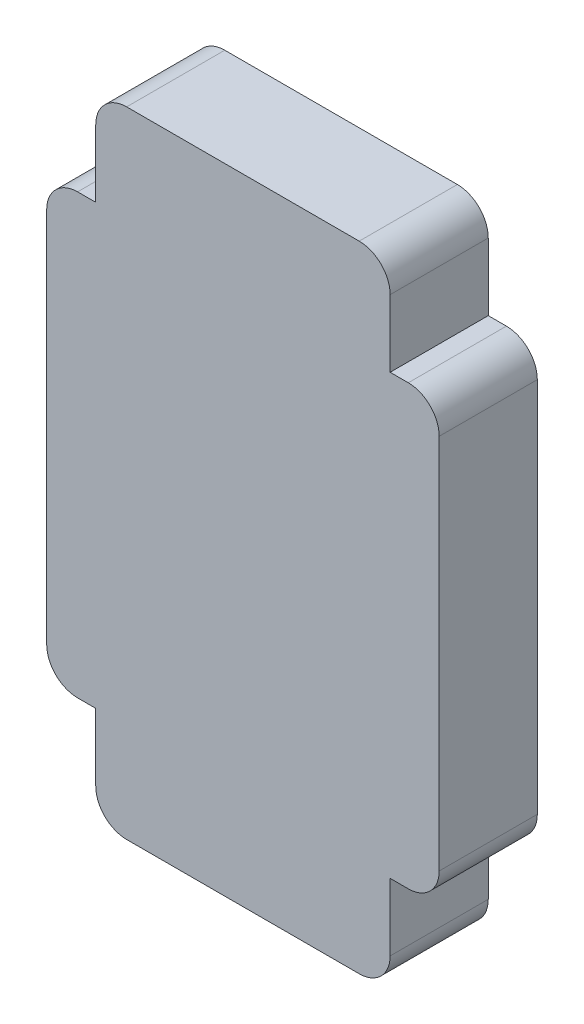
ISO-10303-21;
HEADER;
FILE_DESCRIPTION(('STEP AP214'),'2;1');
FILE_NAME('part.step','',(''),(''),'','','');
FILE_SCHEMA(('AUTOMOTIVE_DESIGN { 1 0 10303 214 1 1 1 1 }'));
ENDSEC;
DATA;
#1=APPLICATION_CONTEXT('core data for automotive mechanical design processes');
#2=APPLICATION_PROTOCOL_DEFINITION('international standard','automotive_design',2000,#1);
#3=PRODUCT_CONTEXT('',#1,'mechanical');
#4=PRODUCT('Part','Part','',(#3));
#5=PRODUCT_RELATED_PRODUCT_CATEGORY('part','',(#4));
#6=PRODUCT_DEFINITION_FORMATION('','',#4);
#7=PRODUCT_DEFINITION_CONTEXT('part definition',#1,'design');
#8=PRODUCT_DEFINITION('design','',#6,#7);
#9=PRODUCT_DEFINITION_SHAPE('','',#8);
#10=(LENGTH_UNIT() NAMED_UNIT(*) SI_UNIT(.MILLI.,.METRE.));
#11=(NAMED_UNIT(*) PLANE_ANGLE_UNIT() SI_UNIT($,.RADIAN.));
#12=(NAMED_UNIT(*) SI_UNIT($,.STERADIAN.) SOLID_ANGLE_UNIT());
#13=UNCERTAINTY_MEASURE_WITH_UNIT(LENGTH_MEASURE(1.E-05),#10,'distance_accuracy_value','');
#14=(GEOMETRIC_REPRESENTATION_CONTEXT(3) GLOBAL_UNCERTAINTY_ASSIGNED_CONTEXT((#13)) GLOBAL_UNIT_ASSIGNED_CONTEXT((#10,
#11,#12)) REPRESENTATION_CONTEXT('',''));
#15=CARTESIAN_POINT('',(0.,0.,0.));
#16=DIRECTION('',(0.,0.,1.));
#17=DIRECTION('',(1.,0.,0.));
#18=AXIS2_PLACEMENT_3D('',#15,#16,#17);
#19=CARTESIAN_POINT('',(-4.7625,0.,3.175));
#20=DIRECTION('',(1.,0.,0.));
#21=DIRECTION('',(0.,0.,-1.));
#22=AXIS2_PLACEMENT_3D('',#19,#20,#21);
#23=PLANE('',#22);
#24=DIRECTION('',(0.,-1.,0.));
#25=VECTOR('',#24,1.);
#26=CARTESIAN_POINT('',(-4.7625,0.,0.));
#27=LINE('',#26,#25);
#28=CARTESIAN_POINT('',(-4.7625,-7.09,0.));
#29=VERTEX_POINT('',#28);
#30=CARTESIAN_POINT('',(-4.7625,-9.265,0.));
#31=VERTEX_POINT('',#30);
#32=EDGE_CURVE('E280',#29,#31,#27,.T.);
#33=ORIENTED_EDGE('',*,*,#32,.T.);
#34=DIRECTION('',(0.,0.,-1.));
#35=VECTOR('',#34,1.);
#36=CARTESIAN_POINT('',(-4.7625,-9.265,3.175));
#37=LINE('',#36,#35);
#38=CARTESIAN_POINT('',(-4.7625,-9.265,3.175));
#39=VERTEX_POINT('',#38);
#40=EDGE_CURVE('E400',#31,#39,#37,.F.);
#41=ORIENTED_EDGE('',*,*,#40,.T.);
#42=DIRECTION('',(0.,-1.,0.));
#43=VECTOR('',#42,1.);
#44=CARTESIAN_POINT('',(-4.7625,0.,3.175));
#45=LINE('',#44,#43);
#46=CARTESIAN_POINT('',(-4.7625,-7.09,3.175));
#47=VERTEX_POINT('',#46);
#48=EDGE_CURVE('E253',#47,#39,#45,.T.);
#49=ORIENTED_EDGE('',*,*,#48,.F.);
#50=DIRECTION('',(0.,0.,-1.));
#51=VECTOR('',#50,1.);
#52=CARTESIAN_POINT('',(-4.7625,-7.09,3.175));
#53=LINE('',#52,#51);
#54=EDGE_CURVE('E319',#47,#29,#53,.T.);
#55=ORIENTED_EDGE('',*,*,#54,.T.);
#56=EDGE_LOOP('',(#33,#41,#49,#55));
#57=FACE_BOUND('',#56,.T.);
#58=ADVANCED_FACE('F41',(#57),#23,.F.);
#59=CARTESIAN_POINT('',(0.,-10.265,3.175));
#60=DIRECTION('',(0.,1.,0.));
#61=DIRECTION('',(0.,0.,1.));
#62=AXIS2_PLACEMENT_3D('',#59,#60,#61);
#63=PLANE('',#62);
#64=DIRECTION('',(1.,0.,0.));
#65=VECTOR('',#64,1.);
#66=CARTESIAN_POINT('',(0.,-10.265,0.));
#67=LINE('',#66,#65);
#68=CARTESIAN_POINT('',(-3.7625,-10.265,0.));
#69=VERTEX_POINT('',#68);
#70=CARTESIAN_POINT('',(3.7625,-10.265,0.));
#71=VERTEX_POINT('',#70);
#72=EDGE_CURVE('E284',#69,#71,#67,.T.);
#73=ORIENTED_EDGE('',*,*,#72,.T.);
#74=DIRECTION('',(0.,0.,-1.));
#75=VECTOR('',#74,1.);
#76=CARTESIAN_POINT('',(3.7625,-10.265,3.175));
#77=LINE('',#76,#75);
#78=CARTESIAN_POINT('',(3.7625,-10.265,3.175));
#79=VERTEX_POINT('',#78);
#80=EDGE_CURVE('E386',#71,#79,#77,.F.);
#81=ORIENTED_EDGE('',*,*,#80,.T.);
#82=DIRECTION('',(1.,0.,0.));
#83=VECTOR('',#82,1.);
#84=CARTESIAN_POINT('',(0.,-10.265,3.175));
#85=LINE('',#84,#83);
#86=CARTESIAN_POINT('',(-3.7625,-10.265,3.175));
#87=VERTEX_POINT('',#86);
#88=EDGE_CURVE('E248',#87,#79,#85,.T.);
#89=ORIENTED_EDGE('',*,*,#88,.F.);
#90=DIRECTION('',(0.,0.,-1.));
#91=VECTOR('',#90,1.);
#92=CARTESIAN_POINT('',(-3.7625,-10.265,3.175));
#93=LINE('',#92,#91);
#94=EDGE_CURVE('E382',#87,#69,#93,.T.);
#95=ORIENTED_EDGE('',*,*,#94,.T.);
#96=EDGE_LOOP('',(#73,#81,#89,#95));
#97=FACE_BOUND('',#96,.T.);
#98=ADVANCED_FACE('F476',(#97),#63,.F.);
#99=CARTESIAN_POINT('',(4.7625,0.,3.175));
#100=DIRECTION('',(1.,0.,0.));
#101=DIRECTION('',(0.,0.,-1.));
#102=AXIS2_PLACEMENT_3D('',#99,#100,#101);
#103=PLANE('',#102);
#104=DIRECTION('',(0.,-1.,0.));
#105=VECTOR('',#104,1.);
#106=CARTESIAN_POINT('',(4.7625,0.,3.175));
#107=LINE('',#106,#105);
#108=CARTESIAN_POINT('',(4.7625,-7.09,3.175));
#109=VERTEX_POINT('',#108);
#110=CARTESIAN_POINT('',(4.7625,-9.265,3.175));
#111=VERTEX_POINT('',#110);
#112=EDGE_CURVE('E222',#109,#111,#107,.T.);
#113=ORIENTED_EDGE('',*,*,#112,.T.);
#114=DIRECTION('',(0.,0.,-1.));
#115=VECTOR('',#114,1.);
#116=CARTESIAN_POINT('',(4.7625,-9.265,0.));
#117=LINE('',#116,#115);
#118=CARTESIAN_POINT('',(4.7625,-9.265,0.));
#119=VERTEX_POINT('',#118);
#120=EDGE_CURVE('E380',#111,#119,#117,.T.);
#121=ORIENTED_EDGE('',*,*,#120,.T.);
#122=DIRECTION('',(0.,-1.,0.));
#123=VECTOR('',#122,1.);
#124=CARTESIAN_POINT('',(4.7625,0.,0.));
#125=LINE('',#124,#123);
#126=CARTESIAN_POINT('',(4.7625,-7.09,0.));
#127=VERTEX_POINT('',#126);
#128=EDGE_CURVE('E225',#127,#119,#125,.T.);
#129=ORIENTED_EDGE('',*,*,#128,.F.);
#130=DIRECTION('',(0.,0.,-1.));
#131=VECTOR('',#130,1.);
#132=CARTESIAN_POINT('',(4.7625,-7.09,3.175));
#133=LINE('',#132,#131);
#134=EDGE_CURVE('E217',#109,#127,#133,.T.);
#135=ORIENTED_EDGE('',*,*,#134,.F.);
#136=EDGE_LOOP('',(#113,#121,#129,#135));
#137=FACE_BOUND('',#136,.T.);
#138=ADVANCED_FACE('F219',(#137),#103,.T.);
#139=CARTESIAN_POINT('',(0.,-7.09,3.175));
#140=DIRECTION('',(0.,1.,0.));
#141=DIRECTION('',(-1.,0.,0.));
#142=AXIS2_PLACEMENT_3D('',#139,#140,#141);
#143=PLANE('',#142);
#144=DIRECTION('',(1.,0.,0.));
#145=VECTOR('',#144,1.);
#146=CARTESIAN_POINT('',(0.,-7.09,0.));
#147=LINE('',#146,#145);
#148=CARTESIAN_POINT('',(5.35,-7.09,0.));
#149=VERTEX_POINT('',#148);
#150=EDGE_CURVE('E290',#127,#149,#147,.T.);
#151=ORIENTED_EDGE('',*,*,#150,.T.);
#152=DIRECTION('',(0.,0.,-1.));
#153=VECTOR('',#152,1.);
#154=CARTESIAN_POINT('',(5.35,-7.09,3.175));
#155=LINE('',#154,#153);
#156=CARTESIAN_POINT('',(5.35,-7.09,3.175));
#157=VERTEX_POINT('',#156);
#158=EDGE_CURVE('E237',#149,#157,#155,.F.);
#159=ORIENTED_EDGE('',*,*,#158,.T.);
#160=DIRECTION('',(1.,0.,0.));
#161=VECTOR('',#160,1.);
#162=CARTESIAN_POINT('',(0.,-7.09,3.175));
#163=LINE('',#162,#161);
#164=EDGE_CURVE('E234',#109,#157,#163,.T.);
#165=ORIENTED_EDGE('',*,*,#164,.F.);
#166=ORIENTED_EDGE('',*,*,#134,.T.);
#167=EDGE_LOOP('',(#151,#159,#165,#166));
#168=FACE_BOUND('',#167,.T.);
#169=ADVANCED_FACE('F235',(#168),#143,.F.);
#170=CARTESIAN_POINT('',(6.35,0.,3.175));
#171=DIRECTION('',(-1.,0.,0.));
#172=DIRECTION('',(0.,0.,1.));
#173=AXIS2_PLACEMENT_3D('',#170,#171,#172);
#174=PLANE('',#173);
#175=DIRECTION('',(0.,1.,0.));
#176=VECTOR('',#175,1.);
#177=CARTESIAN_POINT('',(6.35,0.,3.175));
#178=LINE('',#177,#176);
#179=CARTESIAN_POINT('',(6.35,-6.09,3.175));
#180=VERTEX_POINT('',#179);
#181=CARTESIAN_POINT('',(6.35,6.09,3.175));
#182=VERTEX_POINT('',#181);
#183=EDGE_CURVE('E240',#180,#182,#178,.T.);
#184=ORIENTED_EDGE('',*,*,#183,.F.);
#185=DIRECTION('',(0.,0.,-1.));
#186=VECTOR('',#185,1.);
#187=CARTESIAN_POINT('',(6.35,-6.09,3.175));
#188=LINE('',#187,#186);
#189=CARTESIAN_POINT('',(6.35,-6.09,0.));
#190=VERTEX_POINT('',#189);
#191=EDGE_CURVE('E330',#180,#190,#188,.T.);
#192=ORIENTED_EDGE('',*,*,#191,.T.);
#193=DIRECTION('',(0.,1.,0.));
#194=VECTOR('',#193,1.);
#195=CARTESIAN_POINT('',(6.35,0.,0.));
#196=LINE('',#195,#194);
#197=CARTESIAN_POINT('',(6.35,6.09,0.));
#198=VERTEX_POINT('',#197);
#199=EDGE_CURVE('E293',#190,#198,#196,.T.);
#200=ORIENTED_EDGE('',*,*,#199,.T.);
#201=DIRECTION('',(0.,0.,-1.));
#202=VECTOR('',#201,1.);
#203=CARTESIAN_POINT('',(6.35,6.09,3.175));
#204=LINE('',#203,#202);
#205=EDGE_CURVE('E230',#198,#182,#204,.F.);
#206=ORIENTED_EDGE('',*,*,#205,.T.);
#207=EDGE_LOOP('',(#184,#192,#200,#206));
#208=FACE_BOUND('',#207,.T.);
#209=ADVANCED_FACE('F485',(#208),#174,.F.);
#210=CARTESIAN_POINT('',(0.,7.09,3.175));
#211=DIRECTION('',(0.,1.,0.));
#212=DIRECTION('',(0.,0.,1.));
#213=AXIS2_PLACEMENT_3D('',#210,#211,#212);
#214=PLANE('',#213);
#215=DIRECTION('',(1.,0.,0.));
#216=VECTOR('',#215,1.);
#217=CARTESIAN_POINT('',(0.,7.09,3.175));
#218=LINE('',#217,#216);
#219=CARTESIAN_POINT('',(4.7625,7.09,3.175));
#220=VERTEX_POINT('',#219);
#221=CARTESIAN_POINT('',(5.35,7.09,3.175));
#222=VERTEX_POINT('',#221);
#223=EDGE_CURVE('E260',#220,#222,#218,.T.);
#224=ORIENTED_EDGE('',*,*,#223,.T.);
#225=DIRECTION('',(0.,0.,-1.));
#226=VECTOR('',#225,1.);
#227=CARTESIAN_POINT('',(5.35,7.09,0.));
#228=LINE('',#227,#226);
#229=CARTESIAN_POINT('',(5.35,7.09,0.));
#230=VERTEX_POINT('',#229);
#231=EDGE_CURVE('E50',#222,#230,#228,.T.);
#232=ORIENTED_EDGE('',*,*,#231,.T.);
#233=DIRECTION('',(1.,0.,0.));
#234=VECTOR('',#233,1.);
#235=CARTESIAN_POINT('',(0.,7.09,0.));
#236=LINE('',#235,#234);
#237=CARTESIAN_POINT('',(4.7625,7.09,0.));
#238=VERTEX_POINT('',#237);
#239=EDGE_CURVE('E298',#238,#230,#236,.T.);
#240=ORIENTED_EDGE('',*,*,#239,.F.);
#241=DIRECTION('',(0.,0.,-1.));
#242=VECTOR('',#241,1.);
#243=CARTESIAN_POINT('',(4.7625,7.09,3.175));
#244=LINE('',#243,#242);
#245=EDGE_CURVE('E231',#220,#238,#244,.T.);
#246=ORIENTED_EDGE('',*,*,#245,.F.);
#247=EDGE_LOOP('',(#224,#232,#240,#246));
#248=FACE_BOUND('',#247,.T.);
#249=ADVANCED_FACE('F421',(#248),#214,.T.);
#250=CARTESIAN_POINT('',(4.7625,0.,3.175));
#251=DIRECTION('',(-1.,0.,0.));
#252=DIRECTION('',(0.,-1.,0.));
#253=AXIS2_PLACEMENT_3D('',#250,#251,#252);
#254=PLANE('',#253);
#255=DIRECTION('',(0.,1.,0.));
#256=VECTOR('',#255,1.);
#257=CARTESIAN_POINT('',(4.7625,0.,0.));
#258=LINE('',#257,#256);
#259=CARTESIAN_POINT('',(4.7625,9.265,0.));
#260=VERTEX_POINT('',#259);
#261=EDGE_CURVE('E302',#238,#260,#258,.T.);
#262=ORIENTED_EDGE('',*,*,#261,.T.);
#263=DIRECTION('',(0.,0.,-1.));
#264=VECTOR('',#263,1.);
#265=CARTESIAN_POINT('',(4.7625,9.265,3.175));
#266=LINE('',#265,#264);
#267=CARTESIAN_POINT('',(4.7625,9.265,3.175));
#268=VERTEX_POINT('',#267);
#269=EDGE_CURVE('E11',#260,#268,#266,.F.);
#270=ORIENTED_EDGE('',*,*,#269,.T.);
#271=DIRECTION('',(0.,1.,0.));
#272=VECTOR('',#271,1.);
#273=CARTESIAN_POINT('',(4.7625,0.,3.175));
#274=LINE('',#273,#272);
#275=EDGE_CURVE('E264',#220,#268,#274,.T.);
#276=ORIENTED_EDGE('',*,*,#275,.F.);
#277=ORIENTED_EDGE('',*,*,#245,.T.);
#278=EDGE_LOOP('',(#262,#270,#276,#277));
#279=FACE_BOUND('',#278,.T.);
#280=ADVANCED_FACE('F431',(#279),#254,.F.);
#281=CARTESIAN_POINT('',(0.,10.265,3.175));
#282=DIRECTION('',(0.,1.,0.));
#283=DIRECTION('',(-1.,0.,0.));
#284=AXIS2_PLACEMENT_3D('',#281,#282,#283);
#285=PLANE('',#284);
#286=DIRECTION('',(1.,0.,0.));
#287=VECTOR('',#286,1.);
#288=CARTESIAN_POINT('',(0.,10.265,0.));
#289=LINE('',#288,#287);
#290=CARTESIAN_POINT('',(-3.7625,10.265,0.));
#291=VERTEX_POINT('',#290);
#292=CARTESIAN_POINT('',(3.7625,10.265,0.));
#293=VERTEX_POINT('',#292);
#294=EDGE_CURVE('E307',#291,#293,#289,.T.);
#295=ORIENTED_EDGE('',*,*,#294,.F.);
#296=DIRECTION('',(0.,0.,-1.));
#297=VECTOR('',#296,1.);
#298=CARTESIAN_POINT('',(-3.7625,10.265,3.175));
#299=LINE('',#298,#297);
#300=CARTESIAN_POINT('',(-3.7625,10.265,3.175));
#301=VERTEX_POINT('',#300);
#302=EDGE_CURVE('E414',#291,#301,#299,.F.);
#303=ORIENTED_EDGE('',*,*,#302,.T.);
#304=DIRECTION('',(1.,0.,0.));
#305=VECTOR('',#304,1.);
#306=CARTESIAN_POINT('',(0.,10.265,3.175));
#307=LINE('',#306,#305);
#308=CARTESIAN_POINT('',(3.7625,10.265,3.175));
#309=VERTEX_POINT('',#308);
#310=EDGE_CURVE('E269',#301,#309,#307,.T.);
#311=ORIENTED_EDGE('',*,*,#310,.T.);
#312=DIRECTION('',(0.,0.,-1.));
#313=VECTOR('',#312,1.);
#314=CARTESIAN_POINT('',(3.7625,10.265,0.));
#315=LINE('',#314,#313);
#316=EDGE_CURVE('E410',#309,#293,#315,.T.);
#317=ORIENTED_EDGE('',*,*,#316,.T.);
#318=EDGE_LOOP('',(#295,#303,#311,#317));
#319=FACE_BOUND('',#318,.T.);
#320=ADVANCED_FACE('F440',(#319),#285,.T.);
#321=CARTESIAN_POINT('',(-4.7625,0.,3.175));
#322=DIRECTION('',(-1.,0.,0.));
#323=DIRECTION('',(0.,-1.,0.));
#324=AXIS2_PLACEMENT_3D('',#321,#322,#323);
#325=PLANE('',#324);
#326=DIRECTION('',(0.,1.,0.));
#327=VECTOR('',#326,1.);
#328=CARTESIAN_POINT('',(-4.7625,0.,3.175));
#329=LINE('',#328,#327);
#330=CARTESIAN_POINT('',(-4.7625,7.09,3.175));
#331=VERTEX_POINT('',#330);
#332=CARTESIAN_POINT('',(-4.7625,9.265,3.175));
#333=VERTEX_POINT('',#332);
#334=EDGE_CURVE('E273',#331,#333,#329,.T.);
#335=ORIENTED_EDGE('',*,*,#334,.T.);
#336=DIRECTION('',(0.,0.,-1.));
#337=VECTOR('',#336,1.);
#338=CARTESIAN_POINT('',(-4.7625,9.265,3.175));
#339=LINE('',#338,#337);
#340=CARTESIAN_POINT('',(-4.7625,9.265,0.));
#341=VERTEX_POINT('',#340);
#342=EDGE_CURVE('E406',#333,#341,#339,.T.);
#343=ORIENTED_EDGE('',*,*,#342,.T.);
#344=DIRECTION('',(0.,1.,0.));
#345=VECTOR('',#344,1.);
#346=CARTESIAN_POINT('',(-4.7625,0.,0.));
#347=LINE('',#346,#345);
#348=CARTESIAN_POINT('',(-4.7625,7.09,0.));
#349=VERTEX_POINT('',#348);
#350=EDGE_CURVE('E311',#349,#341,#347,.T.);
#351=ORIENTED_EDGE('',*,*,#350,.F.);
#352=DIRECTION('',(0.,0.,-1.));
#353=VECTOR('',#352,1.);
#354=CARTESIAN_POINT('',(-4.7625,7.09,3.175));
#355=LINE('',#354,#353);
#356=EDGE_CURVE('E322',#331,#349,#355,.T.);
#357=ORIENTED_EDGE('',*,*,#356,.F.);
#358=EDGE_LOOP('',(#335,#343,#351,#357));
#359=FACE_BOUND('',#358,.T.);
#360=ADVANCED_FACE('F448',(#359),#325,.T.);
#361=CARTESIAN_POINT('',(-5.35,7.09,0.));
#362=VERTEX_POINT('',#361);
#363=EDGE_CURVE('E303',#362,#349,#236,.T.);
#364=ORIENTED_EDGE('',*,*,#363,.F.);
#365=DIRECTION('',(0.,0.,-1.));
#366=VECTOR('',#365,1.);
#367=CARTESIAN_POINT('',(-5.35,7.09,3.175));
#368=LINE('',#367,#366);
#369=CARTESIAN_POINT('',(-5.35,7.09,3.175));
#370=VERTEX_POINT('',#369);
#371=EDGE_CURVE('E403',#362,#370,#368,.F.);
#372=ORIENTED_EDGE('',*,*,#371,.T.);
#373=EDGE_CURVE('E265',#370,#331,#218,.T.);
#374=ORIENTED_EDGE('',*,*,#373,.T.);
#375=ORIENTED_EDGE('',*,*,#356,.T.);
#376=EDGE_LOOP('',(#364,#372,#374,#375));
#377=FACE_BOUND('',#376,.T.);
#378=ADVANCED_FACE('F452',(#377),#214,.T.);
#379=CARTESIAN_POINT('',(-6.35,0.,3.175));
#380=DIRECTION('',(-1.,0.,0.));
#381=DIRECTION('',(0.,0.,1.));
#382=AXIS2_PLACEMENT_3D('',#379,#380,#381);
#383=PLANE('',#382);
#384=DIRECTION('',(0.,1.,0.));
#385=VECTOR('',#384,1.);
#386=CARTESIAN_POINT('',(-6.35,0.,0.));
#387=LINE('',#386,#385);
#388=CARTESIAN_POINT('',(-6.35,-6.09,0.));
#389=VERTEX_POINT('',#388);
#390=CARTESIAN_POINT('',(-6.35,6.09,0.));
#391=VERTEX_POINT('',#390);
#392=EDGE_CURVE('E315',#389,#391,#387,.T.);
#393=ORIENTED_EDGE('',*,*,#392,.F.);
#394=DIRECTION('',(0.,0.,-1.));
#395=VECTOR('',#394,1.);
#396=CARTESIAN_POINT('',(-6.35,-6.09,3.175));
#397=LINE('',#396,#395);
#398=CARTESIAN_POINT('',(-6.35,-6.09,3.175));
#399=VERTEX_POINT('',#398);
#400=EDGE_CURVE('E397',#389,#399,#397,.F.);
#401=ORIENTED_EDGE('',*,*,#400,.T.);
#402=DIRECTION('',(0.,1.,0.));
#403=VECTOR('',#402,1.);
#404=CARTESIAN_POINT('',(-6.35,0.,3.175));
#405=LINE('',#404,#403);
#406=CARTESIAN_POINT('',(-6.35,6.09,3.175));
#407=VERTEX_POINT('',#406);
#408=EDGE_CURVE('E277',#399,#407,#405,.T.);
#409=ORIENTED_EDGE('',*,*,#408,.T.);
#410=DIRECTION('',(0.,0.,-1.));
#411=VECTOR('',#410,1.);
#412=CARTESIAN_POINT('',(-6.35,6.09,3.175));
#413=LINE('',#412,#411);
#414=EDGE_CURVE('E393',#407,#391,#413,.T.);
#415=ORIENTED_EDGE('',*,*,#414,.T.);
#416=EDGE_LOOP('',(#393,#401,#409,#415));
#417=FACE_BOUND('',#416,.T.);
#418=ADVANCED_FACE('F520',(#417),#383,.T.);
#419=CARTESIAN_POINT('',(-5.35,-7.09,3.175));
#420=VERTEX_POINT('',#419);
#421=EDGE_CURVE('E242',#420,#47,#163,.T.);
#422=ORIENTED_EDGE('',*,*,#421,.F.);
#423=DIRECTION('',(0.,0.,-1.));
#424=VECTOR('',#423,1.);
#425=CARTESIAN_POINT('',(-5.35,-7.09,0.));
#426=LINE('',#425,#424);
#427=CARTESIAN_POINT('',(-5.35,-7.09,0.));
#428=VERTEX_POINT('',#427);
#429=EDGE_CURVE('E389',#420,#428,#426,.T.);
#430=ORIENTED_EDGE('',*,*,#429,.T.);
#431=EDGE_CURVE('E294',#428,#29,#147,.T.);
#432=ORIENTED_EDGE('',*,*,#431,.T.);
#433=ORIENTED_EDGE('',*,*,#54,.F.);
#434=EDGE_LOOP('',(#422,#430,#432,#433));
#435=FACE_BOUND('',#434,.T.);
#436=ADVANCED_FACE('F463',(#435),#143,.F.);
#437=CARTESIAN_POINT('',(0.,0.,3.175));
#438=DIRECTION('',(0.,0.,1.));
#439=DIRECTION('',(1.,0.,0.));
#440=AXIS2_PLACEMENT_3D('',#437,#438,#439);
#441=PLANE('',#440);
#442=ORIENTED_EDGE('',*,*,#164,.T.);
#443=CARTESIAN_POINT('',(5.35,-6.09,3.175));
#444=DIRECTION('',(0.,0.,1.));
#445=DIRECTION('',(1.,0.,0.));
#446=AXIS2_PLACEMENT_3D('',#443,#444,#445);
#447=CIRCLE('',#446,1.);
#448=EDGE_CURVE('E377',#157,#180,#447,.T.);
#449=ORIENTED_EDGE('',*,*,#448,.T.);
#450=ORIENTED_EDGE('',*,*,#183,.T.);
#451=CARTESIAN_POINT('',(5.35,6.09,3.175));
#452=DIRECTION('',(0.,0.,1.));
#453=DIRECTION('',(1.,0.,0.));
#454=AXIS2_PLACEMENT_3D('',#451,#452,#453);
#455=CIRCLE('',#454,1.);
#456=EDGE_CURVE('E362',#182,#222,#455,.T.);
#457=ORIENTED_EDGE('',*,*,#456,.T.);
#458=ORIENTED_EDGE('',*,*,#223,.F.);
#459=ORIENTED_EDGE('',*,*,#275,.T.);
#460=CARTESIAN_POINT('',(3.7625,9.265,3.175));
#461=DIRECTION('',(0.,0.,1.));
#462=DIRECTION('',(1.,0.,0.));
#463=AXIS2_PLACEMENT_3D('',#460,#461,#462);
#464=CIRCLE('',#463,1.);
#465=EDGE_CURVE('E360',#268,#309,#464,.T.);
#466=ORIENTED_EDGE('',*,*,#465,.T.);
#467=ORIENTED_EDGE('',*,*,#310,.F.);
#468=CARTESIAN_POINT('',(-3.7625,9.265,3.175));
#469=DIRECTION('',(0.,0.,1.));
#470=DIRECTION('',(1.,0.,0.));
#471=AXIS2_PLACEMENT_3D('',#468,#469,#470);
#472=CIRCLE('',#471,1.);
#473=EDGE_CURVE('E365',#301,#333,#472,.T.);
#474=ORIENTED_EDGE('',*,*,#473,.T.);
#475=ORIENTED_EDGE('',*,*,#334,.F.);
#476=ORIENTED_EDGE('',*,*,#373,.F.);
#477=CARTESIAN_POINT('',(-5.35,6.09,3.175));
#478=DIRECTION('',(0.,0.,1.));
#479=DIRECTION('',(1.,0.,0.));
#480=AXIS2_PLACEMENT_3D('',#477,#478,#479);
#481=CIRCLE('',#480,1.);
#482=EDGE_CURVE('E68',#370,#407,#481,.T.);
#483=ORIENTED_EDGE('',*,*,#482,.T.);
#484=ORIENTED_EDGE('',*,*,#408,.F.);
#485=CARTESIAN_POINT('',(-5.35,-6.09,3.175));
#486=DIRECTION('',(0.,0.,1.));
#487=DIRECTION('',(1.,0.,0.));
#488=AXIS2_PLACEMENT_3D('',#485,#486,#487);
#489=CIRCLE('',#488,1.);
#490=EDGE_CURVE('E60',#399,#420,#489,.T.);
#491=ORIENTED_EDGE('',*,*,#490,.T.);
#492=ORIENTED_EDGE('',*,*,#421,.T.);
#493=ORIENTED_EDGE('',*,*,#48,.T.);
#494=CARTESIAN_POINT('',(-3.7625,-9.265,3.175));
#495=DIRECTION('',(0.,0.,1.));
#496=DIRECTION('',(1.,0.,0.));
#497=AXIS2_PLACEMENT_3D('',#494,#495,#496);
#498=CIRCLE('',#497,1.);
#499=EDGE_CURVE('E370',#39,#87,#498,.T.);
#500=ORIENTED_EDGE('',*,*,#499,.T.);
#501=ORIENTED_EDGE('',*,*,#88,.T.);
#502=CARTESIAN_POINT('',(3.7625,-9.265,3.175));
#503=DIRECTION('',(0.,0.,1.));
#504=DIRECTION('',(1.,0.,0.));
#505=AXIS2_PLACEMENT_3D('',#502,#503,#504);
#506=CIRCLE('',#505,1.);
#507=EDGE_CURVE('E246',#79,#111,#506,.T.);
#508=ORIENTED_EDGE('',*,*,#507,.T.);
#509=ORIENTED_EDGE('',*,*,#112,.F.);
#510=EDGE_LOOP('',(#442,#449,#450,#457,#458,#459,#466,#467,#474,#475,#476,#483,#484,#491,#492,
#493,#500,#501,#508,#509));
#511=FACE_BOUND('',#510,.T.);
#512=ADVANCED_FACE('F243',(#511),#441,.T.);
#513=CARTESIAN_POINT('',(0.,0.,0.));
#514=DIRECTION('',(0.,0.,1.));
#515=DIRECTION('',(1.,0.,0.));
#516=AXIS2_PLACEMENT_3D('',#513,#514,#515);
#517=PLANE('',#516);
#518=ORIENTED_EDGE('',*,*,#199,.F.);
#519=CARTESIAN_POINT('',(5.35,-6.09,0.));
#520=DIRECTION('',(0.,0.,1.));
#521=DIRECTION('',(1.,0.,0.));
#522=AXIS2_PLACEMENT_3D('',#519,#520,#521);
#523=CIRCLE('',#522,1.);
#524=EDGE_CURVE('E355',#190,#149,#523,.F.);
#525=ORIENTED_EDGE('',*,*,#524,.T.);
#526=ORIENTED_EDGE('',*,*,#150,.F.);
#527=ORIENTED_EDGE('',*,*,#128,.T.);
#528=CARTESIAN_POINT('',(3.7625,-9.265,0.));
#529=DIRECTION('',(0.,0.,1.));
#530=DIRECTION('',(1.,0.,0.));
#531=AXIS2_PLACEMENT_3D('',#528,#529,#530);
#532=CIRCLE('',#531,1.);
#533=EDGE_CURVE('E352',#119,#71,#532,.F.);
#534=ORIENTED_EDGE('',*,*,#533,.T.);
#535=ORIENTED_EDGE('',*,*,#72,.F.);
#536=CARTESIAN_POINT('',(-3.7625,-9.265,0.));
#537=DIRECTION('',(0.,0.,1.));
#538=DIRECTION('',(1.,0.,0.));
#539=AXIS2_PLACEMENT_3D('',#536,#537,#538);
#540=CIRCLE('',#539,1.);
#541=EDGE_CURVE('E346',#69,#31,#540,.F.);
#542=ORIENTED_EDGE('',*,*,#541,.T.);
#543=ORIENTED_EDGE('',*,*,#32,.F.);
#544=ORIENTED_EDGE('',*,*,#431,.F.);
#545=CARTESIAN_POINT('',(-5.35,-6.09,0.));
#546=DIRECTION('',(0.,0.,1.));
#547=DIRECTION('',(1.,0.,0.));
#548=AXIS2_PLACEMENT_3D('',#545,#546,#547);
#549=CIRCLE('',#548,1.);
#550=EDGE_CURVE('E349',#428,#389,#549,.F.);
#551=ORIENTED_EDGE('',*,*,#550,.T.);
#552=ORIENTED_EDGE('',*,*,#392,.T.);
#553=CARTESIAN_POINT('',(-5.35,6.09,0.));
#554=DIRECTION('',(0.,0.,1.));
#555=DIRECTION('',(1.,0.,0.));
#556=AXIS2_PLACEMENT_3D('',#553,#554,#555);
#557=CIRCLE('',#556,1.);
#558=EDGE_CURVE('E343',#391,#362,#557,.F.);
#559=ORIENTED_EDGE('',*,*,#558,.T.);
#560=ORIENTED_EDGE('',*,*,#363,.T.);
#561=ORIENTED_EDGE('',*,*,#350,.T.);
#562=CARTESIAN_POINT('',(-3.7625,9.265,0.));
#563=DIRECTION('',(0.,0.,1.));
#564=DIRECTION('',(1.,0.,0.));
#565=AXIS2_PLACEMENT_3D('',#562,#563,#564);
#566=CIRCLE('',#565,1.);
#567=EDGE_CURVE('E340',#341,#291,#566,.F.);
#568=ORIENTED_EDGE('',*,*,#567,.T.);
#569=ORIENTED_EDGE('',*,*,#294,.T.);
#570=CARTESIAN_POINT('',(3.7625,9.265,0.));
#571=DIRECTION('',(0.,0.,1.));
#572=DIRECTION('',(1.,0.,0.));
#573=AXIS2_PLACEMENT_3D('',#570,#571,#572);
#574=CIRCLE('',#573,1.);
#575=EDGE_CURVE('E334',#293,#260,#574,.F.);
#576=ORIENTED_EDGE('',*,*,#575,.T.);
#577=ORIENTED_EDGE('',*,*,#261,.F.);
#578=ORIENTED_EDGE('',*,*,#239,.T.);
#579=CARTESIAN_POINT('',(5.35,6.09,0.));
#580=DIRECTION('',(0.,0.,1.));
#581=DIRECTION('',(1.,0.,0.));
#582=AXIS2_PLACEMENT_3D('',#579,#580,#581);
#583=CIRCLE('',#582,1.);
#584=EDGE_CURVE('E337',#230,#198,#583,.F.);
#585=ORIENTED_EDGE('',*,*,#584,.T.);
#586=EDGE_LOOP('',(#518,#525,#526,#527,#534,#535,#542,#543,#544,#551,#552,#559,#560,#561,#568,
#569,#576,#577,#578,#585));
#587=FACE_BOUND('',#586,.T.);
#588=ADVANCED_FACE('F428',(#587),#517,.F.);
#589=CARTESIAN_POINT('',(5.35,-6.09,3.175));
#590=DIRECTION('',(0.,0.,-1.));
#591=DIRECTION('',(-1.,0.,0.));
#592=AXIS2_PLACEMENT_3D('',#589,#590,#591);
#593=CYLINDRICAL_SURFACE('',#592,1.);
#594=ORIENTED_EDGE('',*,*,#448,.F.);
#595=ORIENTED_EDGE('',*,*,#158,.F.);
#596=ORIENTED_EDGE('',*,*,#524,.F.);
#597=ORIENTED_EDGE('',*,*,#191,.F.);
#598=EDGE_LOOP('',(#594,#595,#596,#597));
#599=FACE_BOUND('',#598,.T.);
#600=ADVANCED_FACE('F481',(#599),#593,.T.);
#601=CARTESIAN_POINT('',(3.7625,-9.265,3.175));
#602=DIRECTION('',(0.,0.,1.));
#603=DIRECTION('',(1.,0.,0.));
#604=AXIS2_PLACEMENT_3D('',#601,#602,#603);
#605=CYLINDRICAL_SURFACE('',#604,1.);
#606=ORIENTED_EDGE('',*,*,#507,.F.);
#607=ORIENTED_EDGE('',*,*,#80,.F.);
#608=ORIENTED_EDGE('',*,*,#533,.F.);
#609=ORIENTED_EDGE('',*,*,#120,.F.);
#610=EDGE_LOOP('',(#606,#607,#608,#609));
#611=FACE_BOUND('',#610,.T.);
#612=ADVANCED_FACE('F479',(#611),#605,.T.);
#613=CARTESIAN_POINT('',(-5.35,-6.09,3.175));
#614=DIRECTION('',(0.,0.,1.));
#615=DIRECTION('',(1.,0.,0.));
#616=AXIS2_PLACEMENT_3D('',#613,#614,#615);
#617=CYLINDRICAL_SURFACE('',#616,1.);
#618=ORIENTED_EDGE('',*,*,#490,.F.);
#619=ORIENTED_EDGE('',*,*,#400,.F.);
#620=ORIENTED_EDGE('',*,*,#550,.F.);
#621=ORIENTED_EDGE('',*,*,#429,.F.);
#622=EDGE_LOOP('',(#618,#619,#620,#621));
#623=FACE_BOUND('',#622,.T.);
#624=ADVANCED_FACE('F507',(#623),#617,.T.);
#625=CARTESIAN_POINT('',(-3.7625,-9.265,3.175));
#626=DIRECTION('',(0.,0.,-1.));
#627=DIRECTION('',(-1.,0.,0.));
#628=AXIS2_PLACEMENT_3D('',#625,#626,#627);
#629=CYLINDRICAL_SURFACE('',#628,1.);
#630=ORIENTED_EDGE('',*,*,#499,.F.);
#631=ORIENTED_EDGE('',*,*,#40,.F.);
#632=ORIENTED_EDGE('',*,*,#541,.F.);
#633=ORIENTED_EDGE('',*,*,#94,.F.);
#634=EDGE_LOOP('',(#630,#631,#632,#633));
#635=FACE_BOUND('',#634,.T.);
#636=ADVANCED_FACE('F473',(#635),#629,.T.);
#637=CARTESIAN_POINT('',(-5.35,6.09,3.175));
#638=DIRECTION('',(0.,0.,-1.));
#639=DIRECTION('',(-1.,0.,0.));
#640=AXIS2_PLACEMENT_3D('',#637,#638,#639);
#641=CYLINDRICAL_SURFACE('',#640,1.);
#642=ORIENTED_EDGE('',*,*,#482,.F.);
#643=ORIENTED_EDGE('',*,*,#371,.F.);
#644=ORIENTED_EDGE('',*,*,#558,.F.);
#645=ORIENTED_EDGE('',*,*,#414,.F.);
#646=EDGE_LOOP('',(#642,#643,#644,#645));
#647=FACE_BOUND('',#646,.T.);
#648=ADVANCED_FACE('F493',(#647),#641,.T.);
#649=CARTESIAN_POINT('',(-3.7625,9.265,3.175));
#650=DIRECTION('',(0.,0.,-1.));
#651=DIRECTION('',(-1.,0.,0.));
#652=AXIS2_PLACEMENT_3D('',#649,#650,#651);
#653=CYLINDRICAL_SURFACE('',#652,1.);
#654=ORIENTED_EDGE('',*,*,#473,.F.);
#655=ORIENTED_EDGE('',*,*,#302,.F.);
#656=ORIENTED_EDGE('',*,*,#567,.F.);
#657=ORIENTED_EDGE('',*,*,#342,.F.);
#658=EDGE_LOOP('',(#654,#655,#656,#657));
#659=FACE_BOUND('',#658,.T.);
#660=ADVANCED_FACE('F443',(#659),#653,.T.);
#661=CARTESIAN_POINT('',(5.35,6.09,3.175));
#662=DIRECTION('',(0.,0.,1.));
#663=DIRECTION('',(1.,0.,0.));
#664=AXIS2_PLACEMENT_3D('',#661,#662,#663);
#665=CYLINDRICAL_SURFACE('',#664,1.);
#666=ORIENTED_EDGE('',*,*,#456,.F.);
#667=ORIENTED_EDGE('',*,*,#205,.F.);
#668=ORIENTED_EDGE('',*,*,#584,.F.);
#669=ORIENTED_EDGE('',*,*,#231,.F.);
#670=EDGE_LOOP('',(#666,#667,#668,#669));
#671=FACE_BOUND('',#670,.T.);
#672=ADVANCED_FACE('F487',(#671),#665,.T.);
#673=CARTESIAN_POINT('',(3.7625,9.265,3.175));
#674=DIRECTION('',(0.,0.,1.));
#675=DIRECTION('',(1.,0.,0.));
#676=AXIS2_PLACEMENT_3D('',#673,#674,#675);
#677=CYLINDRICAL_SURFACE('',#676,1.);
#678=ORIENTED_EDGE('',*,*,#465,.F.);
#679=ORIENTED_EDGE('',*,*,#269,.F.);
#680=ORIENTED_EDGE('',*,*,#575,.F.);
#681=ORIENTED_EDGE('',*,*,#316,.F.);
#682=EDGE_LOOP('',(#678,#679,#680,#681));
#683=FACE_BOUND('',#682,.T.);
#684=ADVANCED_FACE('F43',(#683),#677,.T.);
#685=CLOSED_SHELL('',(#58,#98,#138,#169,#209,#249,#280,#320,#360,#378,#418,#436,#512,#588,#600,
#612,#624,#636,#648,#660,#672,#684));
#686=MANIFOLD_SOLID_BREP('B2',#685);
#687=ADVANCED_BREP_SHAPE_REPRESENTATION('',(#18,#686),#14);
#688=SHAPE_DEFINITION_REPRESENTATION(#9,#687);
ENDSEC;
END-ISO-10303-21;
